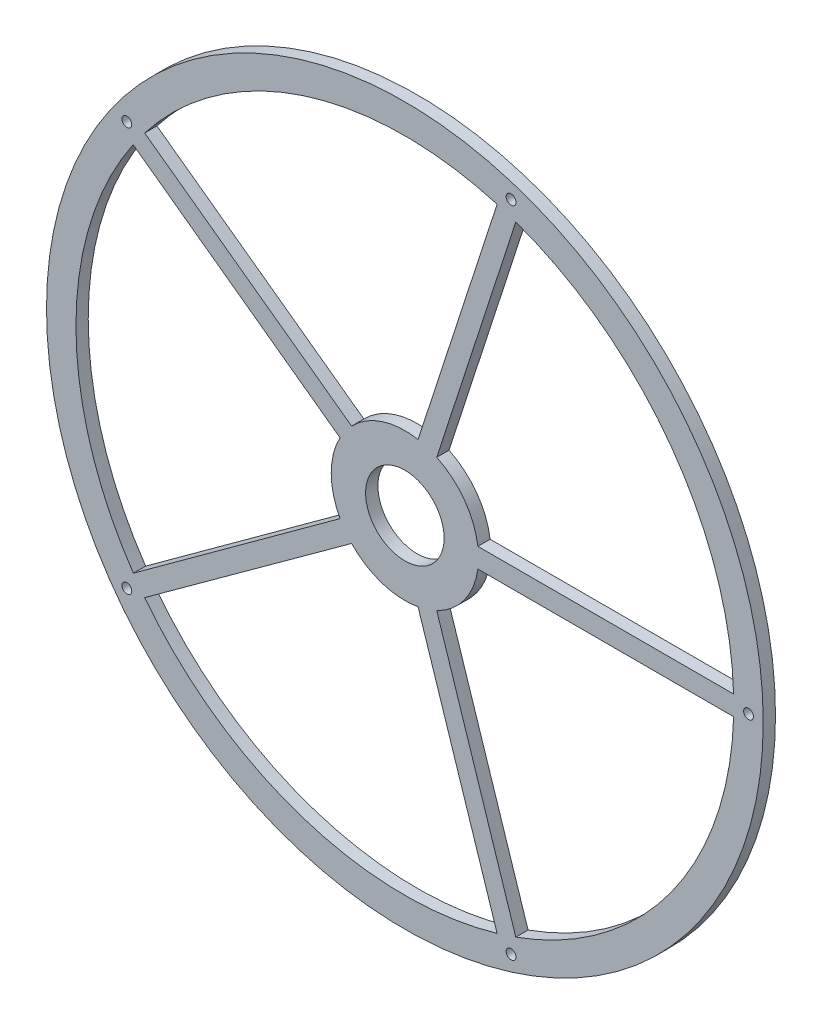
ISO-10303-21;
HEADER;
FILE_DESCRIPTION(('STEP AP214'),'2;1');
FILE_NAME('part.step','',(''),(''),'','','');
FILE_SCHEMA(('AUTOMOTIVE_DESIGN { 1 0 10303 214 1 1 1 1 }'));
ENDSEC;
DATA;
#1=APPLICATION_CONTEXT('core data for automotive mechanical design processes');
#2=APPLICATION_PROTOCOL_DEFINITION('international standard','automotive_design',2000,#1);
#3=PRODUCT_CONTEXT('',#1,'mechanical');
#4=PRODUCT('Part','Part','',(#3));
#5=PRODUCT_RELATED_PRODUCT_CATEGORY('part','',(#4));
#6=PRODUCT_DEFINITION_FORMATION('','',#4);
#7=PRODUCT_DEFINITION_CONTEXT('part definition',#1,'design');
#8=PRODUCT_DEFINITION('design','',#6,#7);
#9=PRODUCT_DEFINITION_SHAPE('','',#8);
#10=(LENGTH_UNIT() NAMED_UNIT(*) SI_UNIT(.MILLI.,.METRE.));
#11=(NAMED_UNIT(*) PLANE_ANGLE_UNIT() SI_UNIT($,.RADIAN.));
#12=(NAMED_UNIT(*) SI_UNIT($,.STERADIAN.) SOLID_ANGLE_UNIT());
#13=UNCERTAINTY_MEASURE_WITH_UNIT(LENGTH_MEASURE(1.E-05),#10,'distance_accuracy_value','');
#14=(GEOMETRIC_REPRESENTATION_CONTEXT(3) GLOBAL_UNCERTAINTY_ASSIGNED_CONTEXT((#13)) GLOBAL_UNIT_ASSIGNED_CONTEXT((#10,
#11,#12)) REPRESENTATION_CONTEXT('',''));
#15=CARTESIAN_POINT('',(0.,0.,0.));
#16=DIRECTION('',(0.,0.,1.));
#17=DIRECTION('',(1.,0.,0.));
#18=AXIS2_PLACEMENT_3D('',#15,#16,#17);
#19=CARTESIAN_POINT('',(0.,0.,0.));
#20=DIRECTION('',(0.,0.,1.));
#21=DIRECTION('',(1.,0.,0.));
#22=AXIS2_PLACEMENT_3D('',#19,#20,#21);
#23=CYLINDRICAL_SURFACE('',#22,67.);
#24=CARTESIAN_POINT('',(0.,0.,0.));
#25=DIRECTION('',(0.,0.,1.));
#26=DIRECTION('',(1.,0.,0.));
#27=AXIS2_PLACEMENT_3D('',#24,#25,#26);
#28=CIRCLE('',#27,67.);
#29=CARTESIAN_POINT('',(22.5970252120168,-63.0743565291591,0.));
#30=VERTEX_POINT('',#29);
#31=CARTESIAN_POINT('',(66.9701426010129,-2.,0.));
#32=VERTEX_POINT('',#31);
#33=EDGE_CURVE('E202',#30,#32,#28,.T.);
#34=ORIENTED_EDGE('',*,*,#33,.F.);
#35=DIRECTION('',(0.,0.,1.));
#36=VECTOR('',#35,1.);
#37=CARTESIAN_POINT('',(22.5970252120168,-63.0743565291591,0.));
#38=LINE('',#37,#36);
#39=CARTESIAN_POINT('',(22.5970252120168,-63.0743565291591,2.5));
#40=VERTEX_POINT('',#39);
#41=EDGE_CURVE('E195',#30,#40,#38,.T.);
#42=ORIENTED_EDGE('',*,*,#41,.T.);
#43=CARTESIAN_POINT('',(0.,0.,2.5));
#44=DIRECTION('',(0.,0.,1.));
#45=DIRECTION('',(1.,0.,0.));
#46=AXIS2_PLACEMENT_3D('',#43,#44,#45);
#47=CIRCLE('',#46,67.);
#48=CARTESIAN_POINT('',(66.9701426010129,-2.,2.5));
#49=VERTEX_POINT('',#48);
#50=EDGE_CURVE('E217',#40,#49,#47,.T.);
#51=ORIENTED_EDGE('',*,*,#50,.T.);
#52=DIRECTION('',(0.,0.,1.));
#53=VECTOR('',#52,1.);
#54=CARTESIAN_POINT('',(66.9701426010129,-2.,0.));
#55=LINE('',#54,#53);
#56=EDGE_CURVE('E212',#32,#49,#55,.T.);
#57=ORIENTED_EDGE('',*,*,#56,.F.);
#58=EDGE_LOOP('',(#34,#42,#51,#57));
#59=FACE_BOUND('',#58,.T.);
#60=ADVANCED_FACE('F39',(#59),#23,.F.);
#61=CARTESIAN_POINT('',(0.,0.,0.));
#62=DIRECTION('',(0.,0.,1.));
#63=DIRECTION('',(1.,0.,0.));
#64=AXIS2_PLACEMENT_3D('',#61,#62,#63);
#65=CYLINDRICAL_SURFACE('',#64,15.);
#66=DIRECTION('',(0.,0.,1.));
#67=VECTOR('',#66,1.);
#68=CARTESIAN_POINT('',(6.49598091505798,-13.5204375650791,0.));
#69=LINE('',#68,#67);
#70=CARTESIAN_POINT('',(6.49598091505798,-13.5204375650791,0.));
#71=VERTEX_POINT('',#70);
#72=CARTESIAN_POINT('',(6.49598091505798,-13.5204375650791,2.5));
#73=VERTEX_POINT('',#72);
#74=EDGE_CURVE('E374',#71,#73,#69,.T.);
#75=ORIENTED_EDGE('',*,*,#74,.F.);
#76=CARTESIAN_POINT('',(0.,0.,0.));
#77=DIRECTION('',(0.,0.,1.));
#78=DIRECTION('',(1.,0.,0.));
#79=AXIS2_PLACEMENT_3D('',#76,#77,#78);
#80=CIRCLE('',#79,15.);
#81=CARTESIAN_POINT('',(14.8660687473185,-2.,0.));
#82=VERTEX_POINT('',#81);
#83=EDGE_CURVE('E313',#71,#82,#80,.T.);
#84=ORIENTED_EDGE('',*,*,#83,.T.);
#85=DIRECTION('',(0.,0.,1.));
#86=VECTOR('',#85,1.);
#87=CARTESIAN_POINT('',(14.8660687473185,-2.,0.));
#88=LINE('',#87,#86);
#89=CARTESIAN_POINT('',(14.8660687473185,-2.,2.5));
#90=VERTEX_POINT('',#89);
#91=EDGE_CURVE('E11',#82,#90,#88,.T.);
#92=ORIENTED_EDGE('',*,*,#91,.T.);
#93=CARTESIAN_POINT('',(0.,0.,2.5));
#94=DIRECTION('',(0.,0.,1.));
#95=DIRECTION('',(1.,0.,0.));
#96=AXIS2_PLACEMENT_3D('',#93,#94,#95);
#97=CIRCLE('',#96,15.);
#98=EDGE_CURVE('E315',#73,#90,#97,.T.);
#99=ORIENTED_EDGE('',*,*,#98,.F.);
#100=EDGE_LOOP('',(#75,#84,#92,#99));
#101=FACE_BOUND('',#100,.T.);
#102=ADVANCED_FACE('F239',(#101),#65,.T.);
#103=CARTESIAN_POINT('',(-53.0044129753477,-40.9820961535498,2.5));
#104=VERTEX_POINT('',#103);
#105=CARTESIAN_POINT('',(18.7927991468362,-64.3104245066589,2.5));
#106=VERTEX_POINT('',#105);
#107=EDGE_CURVE('E194',#104,#106,#47,.T.);
#108=ORIENTED_EDGE('',*,*,#107,.T.);
#109=DIRECTION('',(0.,0.,1.));
#110=VECTOR('',#109,1.);
#111=CARTESIAN_POINT('',(18.7927991468362,-64.3104245066589,0.));
#112=LINE('',#111,#110);
#113=CARTESIAN_POINT('',(18.7927991468362,-64.3104245066589,0.));
#114=VERTEX_POINT('',#113);
#115=EDGE_CURVE('E179',#114,#106,#112,.T.);
#116=ORIENTED_EDGE('',*,*,#115,.F.);
#117=CARTESIAN_POINT('',(-53.0044129753477,-40.9820961535497,0.));
#118=VERTEX_POINT('',#117);
#119=EDGE_CURVE('E192',#118,#114,#28,.T.);
#120=ORIENTED_EDGE('',*,*,#119,.F.);
#121=DIRECTION('',(0.,0.,1.));
#122=VECTOR('',#121,1.);
#123=CARTESIAN_POINT('',(-53.0044129753477,-40.9820961535498,0.));
#124=LINE('',#123,#122);
#125=EDGE_CURVE('E366',#118,#104,#124,.T.);
#126=ORIENTED_EDGE('',*,*,#125,.T.);
#127=EDGE_LOOP('',(#108,#116,#120,#126));
#128=FACE_BOUND('',#127,.T.);
#129=ADVANCED_FACE('F190',(#128),#23,.F.);
#130=DIRECTION('',(0.,0.,1.));
#131=VECTOR('',#130,1.);
#132=CARTESIAN_POINT('',(2.69175484987736,-14.7565055425789,0.));
#133=LINE('',#132,#131);
#134=CARTESIAN_POINT('',(2.69175484987736,-14.7565055425789,2.5));
#135=VERTEX_POINT('',#134);
#136=CARTESIAN_POINT('',(2.69175484987736,-14.7565055425789,0.));
#137=VERTEX_POINT('',#136);
#138=EDGE_CURVE('E182',#135,#137,#133,.F.);
#139=ORIENTED_EDGE('',*,*,#138,.F.);
#140=CARTESIAN_POINT('',(-10.8513317515419,-10.3560899579899,2.5));
#141=VERTEX_POINT('',#140);
#142=EDGE_CURVE('E433',#141,#135,#97,.T.);
#143=ORIENTED_EDGE('',*,*,#142,.F.);
#144=DIRECTION('',(0.,0.,1.));
#145=VECTOR('',#144,1.);
#146=CARTESIAN_POINT('',(-10.8513317515419,-10.3560899579899,0.));
#147=LINE('',#146,#145);
#148=CARTESIAN_POINT('',(-10.8513317515419,-10.3560899579899,0.));
#149=VERTEX_POINT('',#148);
#150=EDGE_CURVE('E359',#149,#141,#147,.T.);
#151=ORIENTED_EDGE('',*,*,#150,.F.);
#152=EDGE_CURVE('E517',#149,#137,#80,.T.);
#153=ORIENTED_EDGE('',*,*,#152,.T.);
#154=EDGE_LOOP('',(#139,#143,#151,#153));
#155=FACE_BOUND('',#154,.T.);
#156=ADVANCED_FACE('F248',(#155),#65,.T.);
#157=CARTESIAN_POINT('',(-55.3555539845184,37.7460281760489,2.5));
#158=VERTEX_POINT('',#157);
#159=CARTESIAN_POINT('',(-55.3030418102858,-37.8229238231233,2.5));
#160=VERTEX_POINT('',#159);
#161=EDGE_CURVE('E282',#158,#160,#47,.T.);
#162=ORIENTED_EDGE('',*,*,#161,.T.);
#163=DIRECTION('',(0.,0.,1.));
#164=VECTOR('',#163,1.);
#165=CARTESIAN_POINT('',(-55.3030418102858,-37.8229238231233,0.));
#166=LINE('',#165,#164);
#167=CARTESIAN_POINT('',(-55.3030418102858,-37.8229238231233,0.));
#168=VERTEX_POINT('',#167);
#169=EDGE_CURVE('E285',#168,#160,#166,.T.);
#170=ORIENTED_EDGE('',*,*,#169,.F.);
#171=CARTESIAN_POINT('',(-55.3555539845183,37.7460281760489,0.));
#172=VERTEX_POINT('',#171);
#173=EDGE_CURVE('E201',#172,#168,#28,.T.);
#174=ORIENTED_EDGE('',*,*,#173,.F.);
#175=DIRECTION('',(0.,0.,1.));
#176=VECTOR('',#175,1.);
#177=CARTESIAN_POINT('',(-55.3555539845184,37.7460281760489,0.));
#178=LINE('',#177,#176);
#179=EDGE_CURVE('E287',#172,#158,#178,.T.);
#180=ORIENTED_EDGE('',*,*,#179,.T.);
#181=EDGE_LOOP('',(#162,#170,#174,#180));
#182=FACE_BOUND('',#181,.T.);
#183=ADVANCED_FACE('F253',(#182),#23,.F.);
#184=DIRECTION('',(0.,0.,1.));
#185=VECTOR('',#184,1.);
#186=CARTESIAN_POINT('',(-13.1925640172702,-7.13836498438031,0.));
#187=LINE('',#186,#185);
#188=CARTESIAN_POINT('',(-13.1925640172702,-7.13836498438031,2.5));
#189=VERTEX_POINT('',#188);
#190=CARTESIAN_POINT('',(-13.1925640172702,-7.13836498438031,0.));
#191=VERTEX_POINT('',#190);
#192=EDGE_CURVE('E364',#189,#191,#187,.F.);
#193=ORIENTED_EDGE('',*,*,#192,.F.);
#194=CARTESIAN_POINT('',(-13.202472760712,7.12002198048985,2.5));
#195=VERTEX_POINT('',#194);
#196=EDGE_CURVE('E437',#195,#189,#97,.T.);
#197=ORIENTED_EDGE('',*,*,#196,.F.);
#198=DIRECTION('',(0.,0.,1.));
#199=VECTOR('',#198,1.);
#200=CARTESIAN_POINT('',(-13.202472760712,7.12002198048985,0.));
#201=LINE('',#200,#199);
#202=CARTESIAN_POINT('',(-13.202472760712,7.12002198048985,0.));
#203=VERTEX_POINT('',#202);
#204=EDGE_CURVE('E342',#203,#195,#201,.T.);
#205=ORIENTED_EDGE('',*,*,#204,.F.);
#206=EDGE_CURVE('E515',#203,#191,#80,.T.);
#207=ORIENTED_EDGE('',*,*,#206,.T.);
#208=EDGE_LOOP('',(#193,#197,#205,#207));
#209=FACE_BOUND('',#208,.T.);
#210=ADVANCED_FACE('F264',(#209),#65,.T.);
#211=CARTESIAN_POINT('',(18.7927991468361,64.3104245066589,2.5));
#212=VERTEX_POINT('',#211);
#213=CARTESIAN_POINT('',(-53.0044129753482,40.9820961535491,2.5));
#214=VERTEX_POINT('',#213);
#215=EDGE_CURVE('E216',#212,#214,#47,.T.);
#216=ORIENTED_EDGE('',*,*,#215,.T.);
#217=DIRECTION('',(0.,0.,1.));
#218=VECTOR('',#217,1.);
#219=CARTESIAN_POINT('',(-53.0044129753482,40.9820961535491,0.));
#220=LINE('',#219,#218);
#221=CARTESIAN_POINT('',(-53.0044129753482,40.9820961535491,0.));
#222=VERTEX_POINT('',#221);
#223=EDGE_CURVE('E349',#222,#214,#220,.T.);
#224=ORIENTED_EDGE('',*,*,#223,.F.);
#225=CARTESIAN_POINT('',(18.7927991468361,64.3104245066589,0.));
#226=VERTEX_POINT('',#225);
#227=EDGE_CURVE('E205',#226,#222,#28,.T.);
#228=ORIENTED_EDGE('',*,*,#227,.F.);
#229=DIRECTION('',(0.,0.,1.));
#230=VECTOR('',#229,1.);
#231=CARTESIAN_POINT('',(18.7927991468361,64.3104245066589,0.));
#232=LINE('',#231,#230);
#233=EDGE_CURVE('E330',#226,#212,#232,.T.);
#234=ORIENTED_EDGE('',*,*,#233,.T.);
#235=EDGE_LOOP('',(#216,#224,#228,#234));
#236=FACE_BOUND('',#235,.T.);
#237=ADVANCED_FACE('F257',(#236),#23,.F.);
#238=DIRECTION('',(0.,0.,1.));
#239=VECTOR('',#238,1.);
#240=CARTESIAN_POINT('',(-10.851331751542,10.3560899579897,0.));
#241=LINE('',#240,#239);
#242=CARTESIAN_POINT('',(-10.851331751542,10.3560899579897,2.5));
#243=VERTEX_POINT('',#242);
#244=CARTESIAN_POINT('',(-10.851331751542,10.3560899579897,0.));
#245=VERTEX_POINT('',#244);
#246=EDGE_CURVE('E347',#243,#245,#241,.F.);
#247=ORIENTED_EDGE('',*,*,#246,.F.);
#248=CARTESIAN_POINT('',(2.69175484987735,14.7565055425789,2.5));
#249=VERTEX_POINT('',#248);
#250=EDGE_CURVE('E314',#249,#243,#97,.T.);
#251=ORIENTED_EDGE('',*,*,#250,.F.);
#252=DIRECTION('',(0.,0.,1.));
#253=VECTOR('',#252,1.);
#254=CARTESIAN_POINT('',(2.69175484987735,14.7565055425789,0.));
#255=LINE('',#254,#253);
#256=CARTESIAN_POINT('',(2.69175484987735,14.7565055425789,0.));
#257=VERTEX_POINT('',#256);
#258=EDGE_CURVE('E323',#257,#249,#255,.T.);
#259=ORIENTED_EDGE('',*,*,#258,.F.);
#260=EDGE_CURVE('E318',#257,#245,#80,.T.);
#261=ORIENTED_EDGE('',*,*,#260,.T.);
#262=EDGE_LOOP('',(#247,#251,#259,#261));
#263=FACE_BOUND('',#262,.T.);
#264=ADVANCED_FACE('F255',(#263),#65,.T.);
#265=CARTESIAN_POINT('',(66.9701426010129,2.,2.5));
#266=VERTEX_POINT('',#265);
#267=CARTESIAN_POINT('',(22.5970252120168,63.0743565291592,2.5));
#268=VERTEX_POINT('',#267);
#269=EDGE_CURVE('E206',#266,#268,#47,.T.);
#270=ORIENTED_EDGE('',*,*,#269,.T.);
#271=DIRECTION('',(0.,0.,1.));
#272=VECTOR('',#271,1.);
#273=CARTESIAN_POINT('',(22.5970252120168,63.0743565291592,0.));
#274=LINE('',#273,#272);
#275=CARTESIAN_POINT('',(22.5970252120168,63.0743565291592,0.));
#276=VERTEX_POINT('',#275);
#277=EDGE_CURVE('E331',#276,#268,#274,.T.);
#278=ORIENTED_EDGE('',*,*,#277,.F.);
#279=CARTESIAN_POINT('',(66.9701426010129,2.,0.));
#280=VERTEX_POINT('',#279);
#281=EDGE_CURVE('E207',#280,#276,#28,.T.);
#282=ORIENTED_EDGE('',*,*,#281,.F.);
#283=DIRECTION('',(0.,0.,1.));
#284=VECTOR('',#283,1.);
#285=CARTESIAN_POINT('',(66.9701426010129,2.,0.));
#286=LINE('',#285,#284);
#287=EDGE_CURVE('E289',#280,#266,#286,.T.);
#288=ORIENTED_EDGE('',*,*,#287,.T.);
#289=EDGE_LOOP('',(#270,#278,#282,#288));
#290=FACE_BOUND('',#289,.T.);
#291=ADVANCED_FACE('F242',(#290),#23,.F.);
#292=CARTESIAN_POINT('',(0.,0.,2.5));
#293=DIRECTION('',(0.,0.,-1.));
#294=DIRECTION('',(-1.,0.,0.));
#295=AXIS2_PLACEMENT_3D('',#292,#293,#294);
#296=CYLINDRICAL_SURFACE('',#295,73.);
#297=CARTESIAN_POINT('',(0.,0.,2.5));
#298=DIRECTION('',(0.,0.,1.));
#299=DIRECTION('',(1.,0.,0.));
#300=AXIS2_PLACEMENT_3D('',#297,#298,#299);
#301=CIRCLE('',#300,73.);
#302=CARTESIAN_POINT('',(73.,0.,2.5));
#303=VERTEX_POINT('',#302);
#304=EDGE_CURVE('E47',#303,#303,#301,.T.);
#305=ORIENTED_EDGE('',*,*,#304,.F.);
#306=EDGE_LOOP('',(#305));
#307=FACE_BOUND('',#306,.T.);
#308=CARTESIAN_POINT('',(0.,0.,0.));
#309=DIRECTION('',(0.,0.,1.));
#310=DIRECTION('',(1.,0.,0.));
#311=AXIS2_PLACEMENT_3D('',#308,#309,#310);
#312=CIRCLE('',#311,73.);
#313=CARTESIAN_POINT('',(73.,0.,0.));
#314=VERTEX_POINT('',#313);
#315=EDGE_CURVE('E211',#314,#314,#312,.T.);
#316=ORIENTED_EDGE('',*,*,#315,.T.);
#317=EDGE_LOOP('',(#316));
#318=FACE_BOUND('',#317,.T.);
#319=ADVANCED_FACE('F41',(#307,#318),#296,.T.);
#320=CARTESIAN_POINT('',(0.,0.,2.5));
#321=DIRECTION('',(0.,0.,1.));
#322=DIRECTION('',(1.,0.,0.));
#323=AXIS2_PLACEMENT_3D('',#320,#321,#322);
#324=PLANE('',#323);
#325=CARTESIAN_POINT('',(70.,0.,2.5));
#326=DIRECTION('',(0.,0.,1.));
#327=DIRECTION('',(1.,0.,0.));
#328=AXIS2_PLACEMENT_3D('',#325,#326,#327);
#329=CIRCLE('',#328,0.999999999999998);
#330=CARTESIAN_POINT('',(71.,0.,2.5));
#331=VERTEX_POINT('',#330);
#332=EDGE_CURVE('E409',#331,#331,#329,.T.);
#333=ORIENTED_EDGE('',*,*,#332,.F.);
#334=EDGE_LOOP('',(#333));
#335=FACE_BOUND('',#334,.T.);
#336=CARTESIAN_POINT('',(21.6311896062461,66.5739561406608,2.5));
#337=DIRECTION('',(0.,0.,1.));
#338=DIRECTION('',(1.,0.,0.));
#339=AXIS2_PLACEMENT_3D('',#336,#337,#338);
#340=CIRCLE('',#339,1.);
#341=CARTESIAN_POINT('',(22.6311896062461,66.5739561406608,2.5));
#342=VERTEX_POINT('',#341);
#343=EDGE_CURVE('E406',#342,#342,#340,.T.);
#344=ORIENTED_EDGE('',*,*,#343,.F.);
#345=EDGE_LOOP('',(#344));
#346=FACE_BOUND('',#345,.T.);
#347=CARTESIAN_POINT('',(-56.6311896062466,41.1449676604728,2.5));
#348=DIRECTION('',(0.,0.,1.));
#349=DIRECTION('',(1.,0.,0.));
#350=AXIS2_PLACEMENT_3D('',#347,#348,#349);
#351=CIRCLE('',#350,0.999999999999998);
#352=CARTESIAN_POINT('',(-55.6311896062466,41.1449676604728,2.5));
#353=VERTEX_POINT('',#352);
#354=EDGE_CURVE('E400',#353,#353,#351,.T.);
#355=ORIENTED_EDGE('',*,*,#354,.F.);
#356=EDGE_LOOP('',(#355));
#357=FACE_BOUND('',#356,.T.);
#358=CARTESIAN_POINT('',(-56.6311896062466,-41.1449676604728,2.5));
#359=DIRECTION('',(0.,0.,1.));
#360=DIRECTION('',(1.,0.,0.));
#361=AXIS2_PLACEMENT_3D('',#358,#359,#360);
#362=CIRCLE('',#361,0.999999999999998);
#363=CARTESIAN_POINT('',(-55.6311896062466,-41.1449676604728,2.5));
#364=VERTEX_POINT('',#363);
#365=EDGE_CURVE('E394',#364,#364,#362,.T.);
#366=ORIENTED_EDGE('',*,*,#365,.F.);
#367=EDGE_LOOP('',(#366));
#368=FACE_BOUND('',#367,.T.);
#369=CARTESIAN_POINT('',(21.6311896062461,-66.5739561406608,2.5));
#370=DIRECTION('',(0.,0.,1.));
#371=DIRECTION('',(1.,0.,0.));
#372=AXIS2_PLACEMENT_3D('',#369,#370,#371);
#373=CIRCLE('',#372,1.);
#374=CARTESIAN_POINT('',(22.6311896062461,-66.5739561406608,2.5));
#375=VERTEX_POINT('',#374);
#376=EDGE_CURVE('E388',#375,#375,#373,.T.);
#377=ORIENTED_EDGE('',*,*,#376,.F.);
#378=EDGE_LOOP('',(#377));
#379=FACE_BOUND('',#378,.T.);
#380=CARTESIAN_POINT('',(0.,0.,2.5));
#381=DIRECTION('',(0.,0.,1.));
#382=DIRECTION('',(1.,0.,0.));
#383=AXIS2_PLACEMENT_3D('',#380,#381,#382);
#384=CIRCLE('',#383,8.);
#385=CARTESIAN_POINT('',(8.,0.,2.5));
#386=VERTEX_POINT('',#385);
#387=EDGE_CURVE('E319',#386,#386,#384,.T.);
#388=ORIENTED_EDGE('',*,*,#387,.F.);
#389=EDGE_LOOP('',(#388));
#390=FACE_BOUND('',#389,.T.);
#391=DIRECTION('',(-0.309016994374945,0.951056516295154,0.));
#392=VECTOR('',#391,1.);
#393=CARTESIAN_POINT('',(1.90211303259031,0.61803398874989,2.5));
#394=LINE('',#393,#392);
#395=EDGE_CURVE('E54',#40,#73,#394,.T.);
#396=ORIENTED_EDGE('',*,*,#395,.T.);
#397=ORIENTED_EDGE('',*,*,#98,.T.);
#398=DIRECTION('',(1.,0.,0.));
#399=VECTOR('',#398,1.);
#400=CARTESIAN_POINT('',(0.,-2.,2.5));
#401=LINE('',#400,#399);
#402=EDGE_CURVE('E302',#90,#49,#401,.T.);
#403=ORIENTED_EDGE('',*,*,#402,.T.);
#404=ORIENTED_EDGE('',*,*,#50,.F.);
#405=EDGE_LOOP('',(#396,#397,#403,#404));
#406=FACE_BOUND('',#405,.T.);
#407=ORIENTED_EDGE('',*,*,#142,.T.);
#408=DIRECTION('',(0.309016994374945,-0.951056516295154,0.));
#409=VECTOR('',#408,1.);
#410=CARTESIAN_POINT('',(-1.90211303259031,-0.618033988749883,2.5));
#411=LINE('',#410,#409);
#412=EDGE_CURVE('E381',#135,#106,#411,.T.);
#413=ORIENTED_EDGE('',*,*,#412,.T.);
#414=ORIENTED_EDGE('',*,*,#107,.F.);
#415=DIRECTION('',(0.809016994374941,0.587785252292482,0.));
#416=VECTOR('',#415,1.);
#417=CARTESIAN_POINT('',(1.17557050458496,-1.61803398874988,2.5));
#418=LINE('',#417,#416);
#419=EDGE_CURVE('E369',#104,#141,#418,.T.);
#420=ORIENTED_EDGE('',*,*,#419,.T.);
#421=EDGE_LOOP('',(#407,#413,#414,#420));
#422=FACE_BOUND('',#421,.T.);
#423=ORIENTED_EDGE('',*,*,#196,.T.);
#424=DIRECTION('',(-0.808199337246578,-0.588909017823799,0.));
#425=VECTOR('',#424,1.);
#426=CARTESIAN_POINT('',(-1.175570504585,1.61803398874986,2.5));
#427=LINE('',#426,#425);
#428=EDGE_CURVE('E372',#189,#160,#427,.T.);
#429=ORIENTED_EDGE('',*,*,#428,.T.);
#430=ORIENTED_EDGE('',*,*,#161,.F.);
#431=DIRECTION('',(0.809016994374953,-0.587785252292466,0.));
#432=VECTOR('',#431,1.);
#433=CARTESIAN_POINT('',(-1.17557050458493,-1.61803398874991,2.5));
#434=LINE('',#433,#432);
#435=EDGE_CURVE('E354',#158,#195,#434,.T.);
#436=ORIENTED_EDGE('',*,*,#435,.T.);
#437=EDGE_LOOP('',(#423,#429,#430,#436));
#438=FACE_BOUND('',#437,.T.);
#439=ORIENTED_EDGE('',*,*,#250,.T.);
#440=DIRECTION('',(-0.809016994374949,0.587785252292471,0.));
#441=VECTOR('',#440,1.);
#442=CARTESIAN_POINT('',(1.17557050458494,1.6180339887499,2.5));
#443=LINE('',#442,#441);
#444=EDGE_CURVE('E357',#243,#214,#443,.T.);
#445=ORIENTED_EDGE('',*,*,#444,.T.);
#446=ORIENTED_EDGE('',*,*,#215,.F.);
#447=DIRECTION('',(-0.309016994374945,-0.951056516295155,0.));
#448=VECTOR('',#447,1.);
#449=CARTESIAN_POINT('',(-1.90211303259031,0.618033988749889,2.5));
#450=LINE('',#449,#448);
#451=EDGE_CURVE('E337',#212,#249,#450,.T.);
#452=ORIENTED_EDGE('',*,*,#451,.T.);
#453=EDGE_LOOP('',(#439,#445,#446,#452));
#454=FACE_BOUND('',#453,.T.);
#455=CARTESIAN_POINT('',(14.8660687473185,2.,2.5));
#456=VERTEX_POINT('',#455);
#457=CARTESIAN_POINT('',(6.49598091505797,13.5204375650791,2.5));
#458=VERTEX_POINT('',#457);
#459=EDGE_CURVE('E310',#456,#458,#97,.T.);
#460=ORIENTED_EDGE('',*,*,#459,.T.);
#461=DIRECTION('',(0.309016994374945,0.951056516295155,0.));
#462=VECTOR('',#461,1.);
#463=CARTESIAN_POINT('',(1.90211303259031,-0.618033988749889,2.5));
#464=LINE('',#463,#462);
#465=EDGE_CURVE('E340',#458,#268,#464,.T.);
#466=ORIENTED_EDGE('',*,*,#465,.T.);
#467=ORIENTED_EDGE('',*,*,#269,.F.);
#468=DIRECTION('',(1.,0.,0.));
#469=VECTOR('',#468,1.);
#470=CARTESIAN_POINT('',(0.,2.,2.5));
#471=LINE('',#470,#469);
#472=EDGE_CURVE('E299',#456,#266,#471,.T.);
#473=ORIENTED_EDGE('',*,*,#472,.F.);
#474=EDGE_LOOP('',(#460,#466,#467,#473));
#475=FACE_BOUND('',#474,.T.);
#476=ORIENTED_EDGE('',*,*,#304,.T.);
#477=EDGE_LOOP('',(#476));
#478=FACE_BOUND('',#477,.T.);
#479=ADVANCED_FACE('F225',(#335,#346,#357,#368,#379,#390,#406,#422,#438,#454,#475,#478),#324,.T.);
#480=CARTESIAN_POINT('',(0.,0.,0.));
#481=DIRECTION('',(0.,0.,1.));
#482=DIRECTION('',(1.,0.,0.));
#483=AXIS2_PLACEMENT_3D('',#480,#481,#482);
#484=PLANE('',#483);
#485=CARTESIAN_POINT('',(70.,0.,0.));
#486=DIRECTION('',(0.,0.,1.));
#487=DIRECTION('',(1.,0.,0.));
#488=AXIS2_PLACEMENT_3D('',#485,#486,#487);
#489=CIRCLE('',#488,0.999999999999998);
#490=CARTESIAN_POINT('',(71.,0.,0.));
#491=VERTEX_POINT('',#490);
#492=EDGE_CURVE('E383',#491,#491,#489,.T.);
#493=ORIENTED_EDGE('',*,*,#492,.T.);
#494=EDGE_LOOP('',(#493));
#495=FACE_BOUND('',#494,.T.);
#496=CARTESIAN_POINT('',(21.6311896062461,66.5739561406608,0.));
#497=DIRECTION('',(0.,0.,1.));
#498=DIRECTION('',(1.,0.,0.));
#499=AXIS2_PLACEMENT_3D('',#496,#497,#498);
#500=CIRCLE('',#499,1.);
#501=CARTESIAN_POINT('',(22.6311896062461,66.5739561406608,0.));
#502=VERTEX_POINT('',#501);
#503=EDGE_CURVE('E403',#502,#502,#500,.T.);
#504=ORIENTED_EDGE('',*,*,#503,.T.);
#505=EDGE_LOOP('',(#504));
#506=FACE_BOUND('',#505,.T.);
#507=CARTESIAN_POINT('',(-56.6311896062466,41.1449676604728,0.));
#508=DIRECTION('',(0.,0.,1.));
#509=DIRECTION('',(1.,0.,0.));
#510=AXIS2_PLACEMENT_3D('',#507,#508,#509);
#511=CIRCLE('',#510,0.999999999999998);
#512=CARTESIAN_POINT('',(-55.6311896062466,41.1449676604728,0.));
#513=VERTEX_POINT('',#512);
#514=EDGE_CURVE('E397',#513,#513,#511,.T.);
#515=ORIENTED_EDGE('',*,*,#514,.T.);
#516=EDGE_LOOP('',(#515));
#517=FACE_BOUND('',#516,.T.);
#518=CARTESIAN_POINT('',(-56.6311896062466,-41.1449676604728,0.));
#519=DIRECTION('',(0.,0.,1.));
#520=DIRECTION('',(1.,0.,0.));
#521=AXIS2_PLACEMENT_3D('',#518,#519,#520);
#522=CIRCLE('',#521,0.999999999999998);
#523=CARTESIAN_POINT('',(-55.6311896062466,-41.1449676604728,0.));
#524=VERTEX_POINT('',#523);
#525=EDGE_CURVE('E391',#524,#524,#522,.T.);
#526=ORIENTED_EDGE('',*,*,#525,.T.);
#527=EDGE_LOOP('',(#526));
#528=FACE_BOUND('',#527,.T.);
#529=CARTESIAN_POINT('',(21.6311896062461,-66.5739561406608,0.));
#530=DIRECTION('',(0.,0.,1.));
#531=DIRECTION('',(1.,0.,0.));
#532=AXIS2_PLACEMENT_3D('',#529,#530,#531);
#533=CIRCLE('',#532,1.);
#534=CARTESIAN_POINT('',(22.6311896062461,-66.5739561406608,0.));
#535=VERTEX_POINT('',#534);
#536=EDGE_CURVE('E385',#535,#535,#533,.T.);
#537=ORIENTED_EDGE('',*,*,#536,.T.);
#538=EDGE_LOOP('',(#537));
#539=FACE_BOUND('',#538,.T.);
#540=ORIENTED_EDGE('',*,*,#83,.F.);
#541=DIRECTION('',(-0.309016994374945,0.951056516295154,0.));
#542=VECTOR('',#541,1.);
#543=CARTESIAN_POINT('',(1.90211303259031,0.61803398874989,0.));
#544=LINE('',#543,#542);
#545=EDGE_CURVE('E62',#30,#71,#544,.T.);
#546=ORIENTED_EDGE('',*,*,#545,.F.);
#547=ORIENTED_EDGE('',*,*,#33,.T.);
#548=DIRECTION('',(1.,0.,0.));
#549=VECTOR('',#548,1.);
#550=CARTESIAN_POINT('',(0.,-2.,0.));
#551=LINE('',#550,#549);
#552=EDGE_CURVE('E301',#82,#32,#551,.T.);
#553=ORIENTED_EDGE('',*,*,#552,.F.);
#554=EDGE_LOOP('',(#540,#546,#547,#553));
#555=FACE_BOUND('',#554,.T.);
#556=DIRECTION('',(-0.808199337246578,-0.588909017823799,0.));
#557=VECTOR('',#556,1.);
#558=CARTESIAN_POINT('',(-1.175570504585,1.61803398874986,0.));
#559=LINE('',#558,#557);
#560=EDGE_CURVE('E371',#191,#168,#559,.T.);
#561=ORIENTED_EDGE('',*,*,#560,.F.);
#562=ORIENTED_EDGE('',*,*,#206,.F.);
#563=DIRECTION('',(0.809016994374953,-0.587785252292466,0.));
#564=VECTOR('',#563,1.);
#565=CARTESIAN_POINT('',(-1.17557050458493,-1.61803398874991,0.));
#566=LINE('',#565,#564);
#567=EDGE_CURVE('E352',#172,#203,#566,.T.);
#568=ORIENTED_EDGE('',*,*,#567,.F.);
#569=ORIENTED_EDGE('',*,*,#173,.T.);
#570=EDGE_LOOP('',(#561,#562,#568,#569));
#571=FACE_BOUND('',#570,.T.);
#572=DIRECTION('',(0.309016994374945,-0.951056516295154,0.));
#573=VECTOR('',#572,1.);
#574=CARTESIAN_POINT('',(-1.90211303259031,-0.618033988749883,0.));
#575=LINE('',#574,#573);
#576=EDGE_CURVE('E176',#137,#114,#575,.T.);
#577=ORIENTED_EDGE('',*,*,#576,.F.);
#578=ORIENTED_EDGE('',*,*,#152,.F.);
#579=DIRECTION('',(0.809016994374941,0.587785252292482,0.));
#580=VECTOR('',#579,1.);
#581=CARTESIAN_POINT('',(1.17557050458496,-1.61803398874988,0.));
#582=LINE('',#581,#580);
#583=EDGE_CURVE('E199',#118,#149,#582,.T.);
#584=ORIENTED_EDGE('',*,*,#583,.F.);
#585=ORIENTED_EDGE('',*,*,#119,.T.);
#586=EDGE_LOOP('',(#577,#578,#584,#585));
#587=FACE_BOUND('',#586,.T.);
#588=CARTESIAN_POINT('',(0.,0.,0.));
#589=DIRECTION('',(0.,0.,1.));
#590=DIRECTION('',(1.,0.,0.));
#591=AXIS2_PLACEMENT_3D('',#588,#589,#590);
#592=CIRCLE('',#591,8.);
#593=CARTESIAN_POINT('',(8.,0.,0.));
#594=VERTEX_POINT('',#593);
#595=EDGE_CURVE('E322',#594,#594,#592,.T.);
#596=ORIENTED_EDGE('',*,*,#595,.T.);
#597=EDGE_LOOP('',(#596));
#598=FACE_BOUND('',#597,.T.);
#599=DIRECTION('',(-0.809016994374949,0.587785252292471,0.));
#600=VECTOR('',#599,1.);
#601=CARTESIAN_POINT('',(1.17557050458494,1.6180339887499,0.));
#602=LINE('',#601,#600);
#603=EDGE_CURVE('E356',#245,#222,#602,.T.);
#604=ORIENTED_EDGE('',*,*,#603,.F.);
#605=ORIENTED_EDGE('',*,*,#260,.F.);
#606=DIRECTION('',(-0.309016994374945,-0.951056516295155,0.));
#607=VECTOR('',#606,1.);
#608=CARTESIAN_POINT('',(-1.90211303259031,0.618033988749889,0.));
#609=LINE('',#608,#607);
#610=EDGE_CURVE('E334',#226,#257,#609,.T.);
#611=ORIENTED_EDGE('',*,*,#610,.F.);
#612=ORIENTED_EDGE('',*,*,#227,.T.);
#613=EDGE_LOOP('',(#604,#605,#611,#612));
#614=FACE_BOUND('',#613,.T.);
#615=DIRECTION('',(0.309016994374945,0.951056516295155,0.));
#616=VECTOR('',#615,1.);
#617=CARTESIAN_POINT('',(1.90211303259031,-0.618033988749889,0.));
#618=LINE('',#617,#616);
#619=CARTESIAN_POINT('',(6.49598091505797,13.5204375650791,0.));
#620=VERTEX_POINT('',#619);
#621=EDGE_CURVE('E339',#620,#276,#618,.T.);
#622=ORIENTED_EDGE('',*,*,#621,.F.);
#623=CARTESIAN_POINT('',(14.8660687473185,2.,0.));
#624=VERTEX_POINT('',#623);
#625=EDGE_CURVE('E309',#624,#620,#80,.T.);
#626=ORIENTED_EDGE('',*,*,#625,.F.);
#627=DIRECTION('',(1.,0.,0.));
#628=VECTOR('',#627,1.);
#629=CARTESIAN_POINT('',(0.,2.,0.));
#630=LINE('',#629,#628);
#631=EDGE_CURVE('E297',#624,#280,#630,.T.);
#632=ORIENTED_EDGE('',*,*,#631,.T.);
#633=ORIENTED_EDGE('',*,*,#281,.T.);
#634=EDGE_LOOP('',(#622,#626,#632,#633));
#635=FACE_BOUND('',#634,.T.);
#636=ORIENTED_EDGE('',*,*,#315,.F.);
#637=EDGE_LOOP('',(#636));
#638=FACE_BOUND('',#637,.T.);
#639=ADVANCED_FACE('F197',(#495,#506,#517,#528,#539,#555,#571,#587,#598,#614,#635,#638),#484,.F.);
#640=CARTESIAN_POINT('',(0.,2.,0.));
#641=DIRECTION('',(0.,-1.,0.));
#642=DIRECTION('',(0.,0.,-1.));
#643=AXIS2_PLACEMENT_3D('',#640,#641,#642);
#644=PLANE('',#643);
#645=ORIENTED_EDGE('',*,*,#631,.F.);
#646=DIRECTION('',(0.,0.,1.));
#647=VECTOR('',#646,1.);
#648=CARTESIAN_POINT('',(14.8660687473185,2.,0.));
#649=LINE('',#648,#647);
#650=EDGE_CURVE('E304',#624,#456,#649,.T.);
#651=ORIENTED_EDGE('',*,*,#650,.T.);
#652=ORIENTED_EDGE('',*,*,#472,.T.);
#653=ORIENTED_EDGE('',*,*,#287,.F.);
#654=EDGE_LOOP('',(#645,#651,#652,#653));
#655=FACE_BOUND('',#654,.T.);
#656=ADVANCED_FACE('F224',(#655),#644,.F.);
#657=CARTESIAN_POINT('',(0.,-2.,0.));
#658=DIRECTION('',(0.,-1.,0.));
#659=DIRECTION('',(0.,0.,-1.));
#660=AXIS2_PLACEMENT_3D('',#657,#658,#659);
#661=PLANE('',#660);
#662=ORIENTED_EDGE('',*,*,#91,.F.);
#663=ORIENTED_EDGE('',*,*,#552,.T.);
#664=ORIENTED_EDGE('',*,*,#56,.T.);
#665=ORIENTED_EDGE('',*,*,#402,.F.);
#666=EDGE_LOOP('',(#662,#663,#664,#665));
#667=FACE_BOUND('',#666,.T.);
#668=ADVANCED_FACE('F231',(#667),#661,.T.);
#669=DIRECTION('',(0.,0.,1.));
#670=VECTOR('',#669,1.);
#671=CARTESIAN_POINT('',(6.49598091505797,13.5204375650791,0.));
#672=LINE('',#671,#670);
#673=EDGE_CURVE('E328',#458,#620,#672,.F.);
#674=ORIENTED_EDGE('',*,*,#673,.F.);
#675=ORIENTED_EDGE('',*,*,#459,.F.);
#676=ORIENTED_EDGE('',*,*,#650,.F.);
#677=ORIENTED_EDGE('',*,*,#625,.T.);
#678=EDGE_LOOP('',(#674,#675,#676,#677));
#679=FACE_BOUND('',#678,.T.);
#680=ADVANCED_FACE('F249',(#679),#65,.T.);
#681=CARTESIAN_POINT('',(0.,0.,0.));
#682=DIRECTION('',(0.,0.,1.));
#683=DIRECTION('',(1.,0.,0.));
#684=AXIS2_PLACEMENT_3D('',#681,#682,#683);
#685=CYLINDRICAL_SURFACE('',#684,8.);
#686=ORIENTED_EDGE('',*,*,#387,.T.);
#687=EDGE_LOOP('',(#686));
#688=FACE_BOUND('',#687,.T.);
#689=ORIENTED_EDGE('',*,*,#595,.F.);
#690=EDGE_LOOP('',(#689));
#691=FACE_BOUND('',#690,.T.);
#692=ADVANCED_FACE('F466',(#688,#691),#685,.F.);
#693=CARTESIAN_POINT('',(-1.90211303259031,0.618033988749889,0.));
#694=DIRECTION('',(-0.951056516295155,0.309016994374945,0.));
#695=DIRECTION('',(-0.309016994374945,-0.951056516295155,0.));
#696=AXIS2_PLACEMENT_3D('',#693,#694,#695);
#697=PLANE('',#696);
#698=ORIENTED_EDGE('',*,*,#610,.T.);
#699=ORIENTED_EDGE('',*,*,#258,.T.);
#700=ORIENTED_EDGE('',*,*,#451,.F.);
#701=ORIENTED_EDGE('',*,*,#233,.F.);
#702=EDGE_LOOP('',(#698,#699,#700,#701));
#703=FACE_BOUND('',#702,.T.);
#704=ADVANCED_FACE('F457',(#703),#697,.T.);
#705=CARTESIAN_POINT('',(1.90211303259031,-0.618033988749889,0.));
#706=DIRECTION('',(0.951056516295155,-0.309016994374945,0.));
#707=DIRECTION('',(0.309016994374945,0.951056516295155,0.));
#708=AXIS2_PLACEMENT_3D('',#705,#706,#707);
#709=PLANE('',#708);
#710=ORIENTED_EDGE('',*,*,#465,.F.);
#711=ORIENTED_EDGE('',*,*,#673,.T.);
#712=ORIENTED_EDGE('',*,*,#621,.T.);
#713=ORIENTED_EDGE('',*,*,#277,.T.);
#714=EDGE_LOOP('',(#710,#711,#712,#713));
#715=FACE_BOUND('',#714,.T.);
#716=ADVANCED_FACE('F452',(#715),#709,.T.);
#717=CARTESIAN_POINT('',(-1.17557050458493,-1.61803398874991,0.));
#718=DIRECTION('',(-0.587785252292466,-0.809016994374953,0.));
#719=DIRECTION('',(0.809016994374953,-0.587785252292466,0.));
#720=AXIS2_PLACEMENT_3D('',#717,#718,#719);
#721=PLANE('',#720);
#722=ORIENTED_EDGE('',*,*,#567,.T.);
#723=ORIENTED_EDGE('',*,*,#204,.T.);
#724=ORIENTED_EDGE('',*,*,#435,.F.);
#725=ORIENTED_EDGE('',*,*,#179,.F.);
#726=EDGE_LOOP('',(#722,#723,#724,#725));
#727=FACE_BOUND('',#726,.T.);
#728=ADVANCED_FACE('F456',(#727),#721,.T.);
#729=CARTESIAN_POINT('',(1.17557050458494,1.6180339887499,0.));
#730=DIRECTION('',(0.587785252292471,0.809016994374949,0.));
#731=DIRECTION('',(-0.809016994374949,0.587785252292471,0.));
#732=AXIS2_PLACEMENT_3D('',#729,#730,#731);
#733=PLANE('',#732);
#734=ORIENTED_EDGE('',*,*,#444,.F.);
#735=ORIENTED_EDGE('',*,*,#246,.T.);
#736=ORIENTED_EDGE('',*,*,#603,.T.);
#737=ORIENTED_EDGE('',*,*,#223,.T.);
#738=EDGE_LOOP('',(#734,#735,#736,#737));
#739=FACE_BOUND('',#738,.T.);
#740=ADVANCED_FACE('F463',(#739),#733,.T.);
#741=CARTESIAN_POINT('',(1.17557050458496,-1.61803398874988,0.));
#742=DIRECTION('',(0.587785252292482,-0.809016994374941,0.));
#743=DIRECTION('',(0.809016994374941,0.587785252292482,0.));
#744=AXIS2_PLACEMENT_3D('',#741,#742,#743);
#745=PLANE('',#744);
#746=ORIENTED_EDGE('',*,*,#583,.T.);
#747=ORIENTED_EDGE('',*,*,#150,.T.);
#748=ORIENTED_EDGE('',*,*,#419,.F.);
#749=ORIENTED_EDGE('',*,*,#125,.F.);
#750=EDGE_LOOP('',(#746,#747,#748,#749));
#751=FACE_BOUND('',#750,.T.);
#752=ADVANCED_FACE('F495',(#751),#745,.T.);
#753=CARTESIAN_POINT('',(-1.175570504585,1.61803398874986,0.));
#754=DIRECTION('',(-0.588909017823799,0.808199337246578,0.));
#755=DIRECTION('',(-0.808199337246578,-0.588909017823799,0.));
#756=AXIS2_PLACEMENT_3D('',#753,#754,#755);
#757=PLANE('',#756);
#758=ORIENTED_EDGE('',*,*,#428,.F.);
#759=ORIENTED_EDGE('',*,*,#192,.T.);
#760=ORIENTED_EDGE('',*,*,#560,.T.);
#761=ORIENTED_EDGE('',*,*,#169,.T.);
#762=EDGE_LOOP('',(#758,#759,#760,#761));
#763=FACE_BOUND('',#762,.T.);
#764=ADVANCED_FACE('F487',(#763),#757,.T.);
#765=CARTESIAN_POINT('',(1.90211303259031,0.61803398874989,0.));
#766=DIRECTION('',(0.951056516295154,0.309016994374945,0.));
#767=DIRECTION('',(-0.309016994374945,0.951056516295154,0.));
#768=AXIS2_PLACEMENT_3D('',#765,#766,#767);
#769=PLANE('',#768);
#770=ORIENTED_EDGE('',*,*,#545,.T.);
#771=ORIENTED_EDGE('',*,*,#74,.T.);
#772=ORIENTED_EDGE('',*,*,#395,.F.);
#773=ORIENTED_EDGE('',*,*,#41,.F.);
#774=EDGE_LOOP('',(#770,#771,#772,#773));
#775=FACE_BOUND('',#774,.T.);
#776=ADVANCED_FACE('F485',(#775),#769,.T.);
#777=CARTESIAN_POINT('',(-1.90211303259031,-0.618033988749883,0.));
#778=DIRECTION('',(-0.951056516295155,-0.309016994374945,0.));
#779=DIRECTION('',(0.309016994374945,-0.951056516295155,0.));
#780=AXIS2_PLACEMENT_3D('',#777,#778,#779);
#781=PLANE('',#780);
#782=ORIENTED_EDGE('',*,*,#412,.F.);
#783=ORIENTED_EDGE('',*,*,#138,.T.);
#784=ORIENTED_EDGE('',*,*,#576,.T.);
#785=ORIENTED_EDGE('',*,*,#115,.T.);
#786=EDGE_LOOP('',(#782,#783,#784,#785));
#787=FACE_BOUND('',#786,.T.);
#788=ADVANCED_FACE('F178',(#787),#781,.T.);
#789=CARTESIAN_POINT('',(21.6311896062461,-66.5739561406608,0.));
#790=DIRECTION('',(0.,0.,1.));
#791=DIRECTION('',(1.,0.,0.));
#792=AXIS2_PLACEMENT_3D('',#789,#790,#791);
#793=CYLINDRICAL_SURFACE('',#792,1.);
#794=ORIENTED_EDGE('',*,*,#536,.F.);
#795=EDGE_LOOP('',(#794));
#796=FACE_BOUND('',#795,.T.);
#797=ORIENTED_EDGE('',*,*,#376,.T.);
#798=EDGE_LOOP('',(#797));
#799=FACE_BOUND('',#798,.T.);
#800=ADVANCED_FACE('F493',(#796,#799),#793,.F.);
#801=CARTESIAN_POINT('',(-56.6311896062466,-41.1449676604728,0.));
#802=DIRECTION('',(0.,0.,1.));
#803=DIRECTION('',(1.,0.,0.));
#804=AXIS2_PLACEMENT_3D('',#801,#802,#803);
#805=CYLINDRICAL_SURFACE('',#804,0.999999999999998);
#806=ORIENTED_EDGE('',*,*,#525,.F.);
#807=EDGE_LOOP('',(#806));
#808=FACE_BOUND('',#807,.T.);
#809=ORIENTED_EDGE('',*,*,#365,.T.);
#810=EDGE_LOOP('',(#809));
#811=FACE_BOUND('',#810,.T.);
#812=ADVANCED_FACE('F603',(#808,#811),#805,.F.);
#813=CARTESIAN_POINT('',(-56.6311896062466,41.1449676604728,0.));
#814=DIRECTION('',(0.,0.,1.));
#815=DIRECTION('',(1.,0.,0.));
#816=AXIS2_PLACEMENT_3D('',#813,#814,#815);
#817=CYLINDRICAL_SURFACE('',#816,0.999999999999998);
#818=ORIENTED_EDGE('',*,*,#514,.F.);
#819=EDGE_LOOP('',(#818));
#820=FACE_BOUND('',#819,.T.);
#821=ORIENTED_EDGE('',*,*,#354,.T.);
#822=EDGE_LOOP('',(#821));
#823=FACE_BOUND('',#822,.T.);
#824=ADVANCED_FACE('F613',(#820,#823),#817,.F.);
#825=CARTESIAN_POINT('',(21.6311896062461,66.5739561406608,0.));
#826=DIRECTION('',(0.,0.,1.));
#827=DIRECTION('',(1.,0.,0.));
#828=AXIS2_PLACEMENT_3D('',#825,#826,#827);
#829=CYLINDRICAL_SURFACE('',#828,1.);
#830=ORIENTED_EDGE('',*,*,#503,.F.);
#831=EDGE_LOOP('',(#830));
#832=FACE_BOUND('',#831,.T.);
#833=ORIENTED_EDGE('',*,*,#343,.T.);
#834=EDGE_LOOP('',(#833));
#835=FACE_BOUND('',#834,.T.);
#836=ADVANCED_FACE('F417',(#832,#835),#829,.F.);
#837=CARTESIAN_POINT('',(70.,0.,0.));
#838=DIRECTION('',(0.,0.,1.));
#839=DIRECTION('',(1.,0.,0.));
#840=AXIS2_PLACEMENT_3D('',#837,#838,#839);
#841=CYLINDRICAL_SURFACE('',#840,0.999999999999998);
#842=ORIENTED_EDGE('',*,*,#492,.F.);
#843=EDGE_LOOP('',(#842));
#844=FACE_BOUND('',#843,.T.);
#845=ORIENTED_EDGE('',*,*,#332,.T.);
#846=EDGE_LOOP('',(#845));
#847=FACE_BOUND('',#846,.T.);
#848=ADVANCED_FACE('F414',(#844,#847),#841,.F.);
#849=CLOSED_SHELL('',(#60,#102,#129,#156,#183,#210,#237,#264,#291,#319,#479,#639,#656,#668,#680,
#692,#704,#716,#728,#740,#752,#764,#776,#788,#800,#812,#824,#836,#848));
#850=MANIFOLD_SOLID_BREP('B2',#849);
#851=ADVANCED_BREP_SHAPE_REPRESENTATION('',(#18,#850),#14);
#852=SHAPE_DEFINITION_REPRESENTATION(#9,#851);
ENDSEC;
END-ISO-10303-21;
